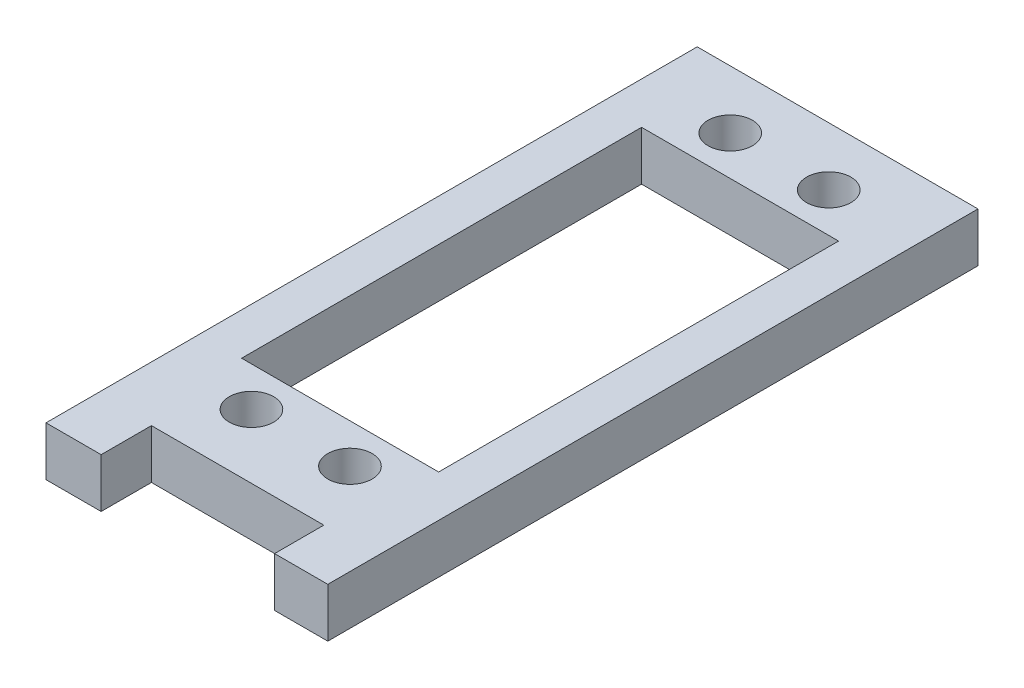
ISO-10303-21;
HEADER;
FILE_DESCRIPTION(('STEP AP214'),'2;1');
FILE_NAME('part.step','',(''),(''),'','','');
FILE_SCHEMA(('AUTOMOTIVE_DESIGN { 1 0 10303 214 1 1 1 1 }'));
ENDSEC;
DATA;
#1=APPLICATION_CONTEXT('core data for automotive mechanical design processes');
#2=APPLICATION_PROTOCOL_DEFINITION('international standard','automotive_design',2000,#1);
#3=PRODUCT_CONTEXT('',#1,'mechanical');
#4=PRODUCT('Part','Part','',(#3));
#5=PRODUCT_RELATED_PRODUCT_CATEGORY('part','',(#4));
#6=PRODUCT_DEFINITION_FORMATION('','',#4);
#7=PRODUCT_DEFINITION_CONTEXT('part definition',#1,'design');
#8=PRODUCT_DEFINITION('design','',#6,#7);
#9=PRODUCT_DEFINITION_SHAPE('','',#8);
#10=(LENGTH_UNIT() NAMED_UNIT(*) SI_UNIT(.MILLI.,.METRE.));
#11=(NAMED_UNIT(*) PLANE_ANGLE_UNIT() SI_UNIT($,.RADIAN.));
#12=(NAMED_UNIT(*) SI_UNIT($,.STERADIAN.) SOLID_ANGLE_UNIT());
#13=UNCERTAINTY_MEASURE_WITH_UNIT(LENGTH_MEASURE(1.E-05),#10,'distance_accuracy_value','');
#14=(GEOMETRIC_REPRESENTATION_CONTEXT(3) GLOBAL_UNCERTAINTY_ASSIGNED_CONTEXT((#13)) GLOBAL_UNIT_ASSIGNED_CONTEXT((#10,
#11,#12)) REPRESENTATION_CONTEXT('',''));
#15=CARTESIAN_POINT('',(0.,0.,0.));
#16=DIRECTION('',(0.,0.,1.));
#17=DIRECTION('',(1.,0.,0.));
#18=AXIS2_PLACEMENT_3D('',#15,#16,#17);
#19=CARTESIAN_POINT('',(0.,5.,0.));
#20=DIRECTION('',(0.,-1.,0.));
#21=DIRECTION('',(0.,0.,-1.));
#22=AXIS2_PLACEMENT_3D('',#19,#20,#21);
#23=PLANE('',#22);
#24=DIRECTION('',(0.,0.,-1.));
#25=VECTOR('',#24,1.);
#26=CARTESIAN_POINT('',(24.25,5.,-7.4));
#27=LINE('',#26,#25);
#28=CARTESIAN_POINT('',(24.25,5.,56.1));
#29=VERTEX_POINT('',#28);
#30=CARTESIAN_POINT('',(24.25,5.,-9.9));
#31=VERTEX_POINT('',#30);
#32=EDGE_CURVE('E161',#29,#31,#27,.T.);
#33=ORIENTED_EDGE('',*,*,#32,.T.);
#34=DIRECTION('',(-1.,0.,0.));
#35=VECTOR('',#34,1.);
#36=CARTESIAN_POINT('',(-4.25,5.,-9.9));
#37=LINE('',#36,#35);
#38=CARTESIAN_POINT('',(-4.25,5.,-9.9));
#39=VERTEX_POINT('',#38);
#40=EDGE_CURVE('E164',#31,#39,#37,.T.);
#41=ORIENTED_EDGE('',*,*,#40,.T.);
#42=DIRECTION('',(0.,0.,1.));
#43=VECTOR('',#42,1.);
#44=CARTESIAN_POINT('',(-4.25,5.,-7.4));
#45=LINE('',#44,#43);
#46=CARTESIAN_POINT('',(-4.25,5.,56.2048021464785));
#47=VERTEX_POINT('',#46);
#48=EDGE_CURVE('E167',#39,#47,#45,.T.);
#49=ORIENTED_EDGE('',*,*,#48,.T.);
#50=DIRECTION('',(1.,0.,0.));
#51=VECTOR('',#50,1.);
#52=CARTESIAN_POINT('',(1.34811792568801,5.,56.2048021464785));
#53=LINE('',#52,#51);
#54=CARTESIAN_POINT('',(1.34811792568801,5.,56.2048021464785));
#55=VERTEX_POINT('',#54);
#56=EDGE_CURVE('E169',#47,#55,#53,.T.);
#57=ORIENTED_EDGE('',*,*,#56,.T.);
#58=DIRECTION('',(0.,0.,-1.));
#59=VECTOR('',#58,1.);
#60=CARTESIAN_POINT('',(1.34811792568801,5.,56.2048021464785));
#61=LINE('',#60,#59);
#62=CARTESIAN_POINT('',(1.34811792568801,5.,51.1));
#63=VERTEX_POINT('',#62);
#64=EDGE_CURVE('E171',#55,#63,#61,.T.);
#65=ORIENTED_EDGE('',*,*,#64,.T.);
#66=DIRECTION('',(1.,0.,0.));
#67=VECTOR('',#66,1.);
#68=CARTESIAN_POINT('',(1.34811792568801,5.,51.1));
#69=LINE('',#68,#67);
#70=CARTESIAN_POINT('',(18.848117925688,5.,51.1));
#71=VERTEX_POINT('',#70);
#72=EDGE_CURVE('E173',#63,#71,#69,.T.);
#73=ORIENTED_EDGE('',*,*,#72,.T.);
#74=DIRECTION('',(0.,0.,1.));
#75=VECTOR('',#74,1.);
#76=CARTESIAN_POINT('',(18.848117925688,5.,56.1));
#77=LINE('',#76,#75);
#78=CARTESIAN_POINT('',(18.848117925688,5.,56.1));
#79=VERTEX_POINT('',#78);
#80=EDGE_CURVE('E175',#71,#79,#77,.T.);
#81=ORIENTED_EDGE('',*,*,#80,.T.);
#82=DIRECTION('',(1.,0.,0.));
#83=VECTOR('',#82,1.);
#84=CARTESIAN_POINT('',(18.848117925688,5.,56.1));
#85=LINE('',#84,#83);
#86=EDGE_CURVE('E177',#79,#29,#85,.T.);
#87=ORIENTED_EDGE('',*,*,#86,.T.);
#88=EDGE_LOOP('',(#33,#41,#49,#57,#65,#73,#81,#87));
#89=FACE_BOUND('',#88,.T.);
#90=DIRECTION('',(0.,0.,1.));
#91=VECTOR('',#90,1.);
#92=CARTESIAN_POINT('',(0.,5.,0.));
#93=LINE('',#92,#91);
#94=CARTESIAN_POINT('',(0.,5.,0.));
#95=VERTEX_POINT('',#94);
#96=CARTESIAN_POINT('',(0.,5.,40.6));
#97=VERTEX_POINT('',#96);
#98=EDGE_CURVE('E122',#95,#97,#93,.T.);
#99=ORIENTED_EDGE('',*,*,#98,.F.);
#100=DIRECTION('',(-1.,0.,0.));
#101=VECTOR('',#100,1.);
#102=CARTESIAN_POINT('',(0.,5.,0.));
#103=LINE('',#102,#101);
#104=CARTESIAN_POINT('',(20.,5.,0.));
#105=VERTEX_POINT('',#104);
#106=EDGE_CURVE('E145',#105,#95,#103,.T.);
#107=ORIENTED_EDGE('',*,*,#106,.F.);
#108=DIRECTION('',(0.,0.,-1.));
#109=VECTOR('',#108,1.);
#110=CARTESIAN_POINT('',(20.,5.,0.));
#111=LINE('',#110,#109);
#112=CARTESIAN_POINT('',(20.,5.,40.6));
#113=VERTEX_POINT('',#112);
#114=EDGE_CURVE('E143',#113,#105,#111,.T.);
#115=ORIENTED_EDGE('',*,*,#114,.F.);
#116=DIRECTION('',(1.,0.,0.));
#117=VECTOR('',#116,1.);
#118=CARTESIAN_POINT('',(0.,5.,40.6));
#119=LINE('',#118,#117);
#120=EDGE_CURVE('E130',#97,#113,#119,.T.);
#121=ORIENTED_EDGE('',*,*,#120,.F.);
#122=EDGE_LOOP('',(#99,#107,#115,#121));
#123=FACE_BOUND('',#122,.T.);
#124=CARTESIAN_POINT('',(5.,5.,-3.99999999999999));
#125=DIRECTION('',(0.,1.,0.));
#126=DIRECTION('',(0.,0.,1.));
#127=AXIS2_PLACEMENT_3D('',#124,#125,#126);
#128=CIRCLE('',#127,2.25);
#129=CARTESIAN_POINT('',(5.,5.,-1.74999999999999));
#130=VERTEX_POINT('',#129);
#131=EDGE_CURVE('E151',#130,#130,#128,.T.);
#132=ORIENTED_EDGE('',*,*,#131,.F.);
#133=EDGE_LOOP('',(#132));
#134=FACE_BOUND('',#133,.T.);
#135=CARTESIAN_POINT('',(15.,5.,-3.99999999999999));
#136=DIRECTION('',(0.,1.,0.));
#137=DIRECTION('',(0.,0.,-1.));
#138=AXIS2_PLACEMENT_3D('',#135,#136,#137);
#139=CIRCLE('',#138,2.25);
#140=CARTESIAN_POINT('',(15.,5.,-6.25));
#141=VERTEX_POINT('',#140);
#142=EDGE_CURVE('E443',#141,#141,#139,.T.);
#143=ORIENTED_EDGE('',*,*,#142,.F.);
#144=EDGE_LOOP('',(#143));
#145=FACE_BOUND('',#144,.T.);
#146=CARTESIAN_POINT('',(5.00000000000001,5.,44.6));
#147=DIRECTION('',(0.,1.,0.));
#148=DIRECTION('',(0.,0.,-1.));
#149=AXIS2_PLACEMENT_3D('',#146,#147,#148);
#150=CIRCLE('',#149,2.25);
#151=CARTESIAN_POINT('',(5.00000000000001,5.,42.35));
#152=VERTEX_POINT('',#151);
#153=EDGE_CURVE('E437',#152,#152,#150,.T.);
#154=ORIENTED_EDGE('',*,*,#153,.F.);
#155=EDGE_LOOP('',(#154));
#156=FACE_BOUND('',#155,.T.);
#157=CARTESIAN_POINT('',(15.,5.,44.6));
#158=DIRECTION('',(0.,1.,0.));
#159=DIRECTION('',(0.,0.,1.));
#160=AXIS2_PLACEMENT_3D('',#157,#158,#159);
#161=CIRCLE('',#160,2.25000000000001);
#162=CARTESIAN_POINT('',(15.,5.,46.85));
#163=VERTEX_POINT('',#162);
#164=EDGE_CURVE('E428',#163,#163,#161,.T.);
#165=ORIENTED_EDGE('',*,*,#164,.F.);
#166=EDGE_LOOP('',(#165));
#167=FACE_BOUND('',#166,.T.);
#168=ADVANCED_FACE('F33',(#89,#123,#134,#145,#156,#167),#23,.F.);
#169=CARTESIAN_POINT('',(0.,0.,0.));
#170=DIRECTION('',(0.,-1.,0.));
#171=DIRECTION('',(0.,0.,-1.));
#172=AXIS2_PLACEMENT_3D('',#169,#170,#171);
#173=PLANE('',#172);
#174=CARTESIAN_POINT('',(5.00000000000001,0.,44.6));
#175=DIRECTION('',(0.,1.,0.));
#176=DIRECTION('',(0.,0.,-1.));
#177=AXIS2_PLACEMENT_3D('',#174,#175,#176);
#178=CIRCLE('',#177,2.25);
#179=CARTESIAN_POINT('',(5.00000000000001,0.,42.35));
#180=VERTEX_POINT('',#179);
#181=EDGE_CURVE('E434',#180,#180,#178,.T.);
#182=ORIENTED_EDGE('',*,*,#181,.T.);
#183=EDGE_LOOP('',(#182));
#184=FACE_BOUND('',#183,.T.);
#185=CARTESIAN_POINT('',(5.,0.,-3.99999999999999));
#186=DIRECTION('',(0.,1.,0.));
#187=DIRECTION('',(0.,0.,1.));
#188=AXIS2_PLACEMENT_3D('',#185,#186,#187);
#189=CIRCLE('',#188,2.25);
#190=CARTESIAN_POINT('',(5.,0.,-1.74999999999999));
#191=VERTEX_POINT('',#190);
#192=EDGE_CURVE('E446',#191,#191,#189,.T.);
#193=ORIENTED_EDGE('',*,*,#192,.T.);
#194=EDGE_LOOP('',(#193));
#195=FACE_BOUND('',#194,.T.);
#196=DIRECTION('',(-1.,0.,0.));
#197=VECTOR('',#196,1.);
#198=CARTESIAN_POINT('',(-4.25,0.,-9.9));
#199=LINE('',#198,#197);
#200=CARTESIAN_POINT('',(24.25,0.,-9.9));
#201=VERTEX_POINT('',#200);
#202=CARTESIAN_POINT('',(-4.25,0.,-9.9));
#203=VERTEX_POINT('',#202);
#204=EDGE_CURVE('E138',#201,#203,#199,.T.);
#205=ORIENTED_EDGE('',*,*,#204,.F.);
#206=DIRECTION('',(0.,0.,-1.));
#207=VECTOR('',#206,1.);
#208=CARTESIAN_POINT('',(24.25,0.,48.));
#209=LINE('',#208,#207);
#210=CARTESIAN_POINT('',(24.25,0.,56.1));
#211=VERTEX_POINT('',#210);
#212=EDGE_CURVE('E165',#211,#201,#209,.T.);
#213=ORIENTED_EDGE('',*,*,#212,.F.);
#214=DIRECTION('',(1.,0.,0.));
#215=VECTOR('',#214,1.);
#216=CARTESIAN_POINT('',(18.848117925688,0.,56.1));
#217=LINE('',#216,#215);
#218=CARTESIAN_POINT('',(18.848117925688,0.,56.1));
#219=VERTEX_POINT('',#218);
#220=EDGE_CURVE('E193',#219,#211,#217,.T.);
#221=ORIENTED_EDGE('',*,*,#220,.F.);
#222=DIRECTION('',(0.,0.,1.));
#223=VECTOR('',#222,1.);
#224=CARTESIAN_POINT('',(18.848117925688,0.,56.1));
#225=LINE('',#224,#223);
#226=CARTESIAN_POINT('',(18.848117925688,0.,51.1));
#227=VERTEX_POINT('',#226);
#228=EDGE_CURVE('E191',#227,#219,#225,.T.);
#229=ORIENTED_EDGE('',*,*,#228,.F.);
#230=DIRECTION('',(1.,0.,0.));
#231=VECTOR('',#230,1.);
#232=CARTESIAN_POINT('',(1.34811792568801,0.,51.1));
#233=LINE('',#232,#231);
#234=CARTESIAN_POINT('',(1.34811792568801,0.,51.1));
#235=VERTEX_POINT('',#234);
#236=EDGE_CURVE('E189',#235,#227,#233,.T.);
#237=ORIENTED_EDGE('',*,*,#236,.F.);
#238=DIRECTION('',(0.,0.,-1.));
#239=VECTOR('',#238,1.);
#240=CARTESIAN_POINT('',(1.34811792568801,0.,56.2048021464785));
#241=LINE('',#240,#239);
#242=CARTESIAN_POINT('',(1.34811792568801,0.,56.2048021464785));
#243=VERTEX_POINT('',#242);
#244=EDGE_CURVE('E187',#243,#235,#241,.T.);
#245=ORIENTED_EDGE('',*,*,#244,.F.);
#246=DIRECTION('',(1.,0.,0.));
#247=VECTOR('',#246,1.);
#248=CARTESIAN_POINT('',(1.34811792568801,0.,56.2048021464785));
#249=LINE('',#248,#247);
#250=CARTESIAN_POINT('',(-4.25,0.,56.2048021464785));
#251=VERTEX_POINT('',#250);
#252=EDGE_CURVE('E185',#251,#243,#249,.T.);
#253=ORIENTED_EDGE('',*,*,#252,.F.);
#254=DIRECTION('',(0.,0.,1.));
#255=VECTOR('',#254,1.);
#256=CARTESIAN_POINT('',(-4.25,0.,48.));
#257=LINE('',#256,#255);
#258=EDGE_CURVE('E183',#203,#251,#257,.T.);
#259=ORIENTED_EDGE('',*,*,#258,.F.);
#260=EDGE_LOOP('',(#205,#213,#221,#229,#237,#245,#253,#259));
#261=FACE_BOUND('',#260,.T.);
#262=DIRECTION('',(-1.,0.,0.));
#263=VECTOR('',#262,1.);
#264=CARTESIAN_POINT('',(0.,0.,0.));
#265=LINE('',#264,#263);
#266=CARTESIAN_POINT('',(20.,0.,0.));
#267=VERTEX_POINT('',#266);
#268=CARTESIAN_POINT('',(0.,0.,0.));
#269=VERTEX_POINT('',#268);
#270=EDGE_CURVE('E131',#267,#269,#265,.T.);
#271=ORIENTED_EDGE('',*,*,#270,.T.);
#272=DIRECTION('',(0.,0.,1.));
#273=VECTOR('',#272,1.);
#274=CARTESIAN_POINT('',(0.,0.,0.));
#275=LINE('',#274,#273);
#276=CARTESIAN_POINT('',(0.,0.,40.6));
#277=VERTEX_POINT('',#276);
#278=EDGE_CURVE('E56',#269,#277,#275,.T.);
#279=ORIENTED_EDGE('',*,*,#278,.T.);
#280=DIRECTION('',(1.,0.,0.));
#281=VECTOR('',#280,1.);
#282=CARTESIAN_POINT('',(0.,0.,40.6));
#283=LINE('',#282,#281);
#284=CARTESIAN_POINT('',(20.,0.,40.6));
#285=VERTEX_POINT('',#284);
#286=EDGE_CURVE('E137',#277,#285,#283,.T.);
#287=ORIENTED_EDGE('',*,*,#286,.T.);
#288=DIRECTION('',(0.,0.,-1.));
#289=VECTOR('',#288,1.);
#290=CARTESIAN_POINT('',(20.,0.,0.));
#291=LINE('',#290,#289);
#292=EDGE_CURVE('E153',#285,#267,#291,.T.);
#293=ORIENTED_EDGE('',*,*,#292,.T.);
#294=EDGE_LOOP('',(#271,#279,#287,#293));
#295=FACE_BOUND('',#294,.T.);
#296=CARTESIAN_POINT('',(15.,0.,-3.99999999999999));
#297=DIRECTION('',(0.,1.,0.));
#298=DIRECTION('',(0.,0.,-1.));
#299=AXIS2_PLACEMENT_3D('',#296,#297,#298);
#300=CIRCLE('',#299,2.25);
#301=CARTESIAN_POINT('',(15.,0.,-6.25));
#302=VERTEX_POINT('',#301);
#303=EDGE_CURVE('E440',#302,#302,#300,.T.);
#304=ORIENTED_EDGE('',*,*,#303,.T.);
#305=EDGE_LOOP('',(#304));
#306=FACE_BOUND('',#305,.T.);
#307=CARTESIAN_POINT('',(15.,0.,44.6));
#308=DIRECTION('',(0.,1.,0.));
#309=DIRECTION('',(0.,0.,1.));
#310=AXIS2_PLACEMENT_3D('',#307,#308,#309);
#311=CIRCLE('',#310,2.25000000000001);
#312=CARTESIAN_POINT('',(15.,0.,46.85));
#313=VERTEX_POINT('',#312);
#314=EDGE_CURVE('E431',#313,#313,#311,.T.);
#315=ORIENTED_EDGE('',*,*,#314,.T.);
#316=EDGE_LOOP('',(#315));
#317=FACE_BOUND('',#316,.T.);
#318=ADVANCED_FACE('F223',(#184,#195,#261,#295,#306,#317),#173,.T.);
#319=CARTESIAN_POINT('',(-4.25,5.,-9.9));
#320=DIRECTION('',(0.,0.,1.));
#321=DIRECTION('',(1.,0.,0.));
#322=AXIS2_PLACEMENT_3D('',#319,#320,#321);
#323=PLANE('',#322);
#324=ORIENTED_EDGE('',*,*,#204,.T.);
#325=DIRECTION('',(0.,-1.,0.));
#326=VECTOR('',#325,1.);
#327=CARTESIAN_POINT('',(-4.25,5.,-9.9));
#328=LINE('',#327,#326);
#329=EDGE_CURVE('E41',#39,#203,#328,.T.);
#330=ORIENTED_EDGE('',*,*,#329,.F.);
#331=ORIENTED_EDGE('',*,*,#40,.F.);
#332=DIRECTION('',(0.,-1.,0.));
#333=VECTOR('',#332,1.);
#334=CARTESIAN_POINT('',(24.25,5.,-9.9));
#335=LINE('',#334,#333);
#336=EDGE_CURVE('E11',#31,#201,#335,.T.);
#337=ORIENTED_EDGE('',*,*,#336,.T.);
#338=EDGE_LOOP('',(#324,#330,#331,#337));
#339=FACE_BOUND('',#338,.T.);
#340=ADVANCED_FACE('F35',(#339),#323,.F.);
#341=CARTESIAN_POINT('',(-4.25,5.,48.));
#342=DIRECTION('',(1.,0.,0.));
#343=DIRECTION('',(0.,0.,-1.));
#344=AXIS2_PLACEMENT_3D('',#341,#342,#343);
#345=PLANE('',#344);
#346=ORIENTED_EDGE('',*,*,#258,.T.);
#347=DIRECTION('',(0.,-1.,0.));
#348=VECTOR('',#347,1.);
#349=CARTESIAN_POINT('',(-4.25,5.,56.2048021464785));
#350=LINE('',#349,#348);
#351=EDGE_CURVE('E211',#47,#251,#350,.T.);
#352=ORIENTED_EDGE('',*,*,#351,.F.);
#353=ORIENTED_EDGE('',*,*,#48,.F.);
#354=ORIENTED_EDGE('',*,*,#329,.T.);
#355=EDGE_LOOP('',(#346,#352,#353,#354));
#356=FACE_BOUND('',#355,.T.);
#357=ADVANCED_FACE('F217',(#356),#345,.F.);
#358=CARTESIAN_POINT('',(1.34811792568801,5.,56.2048021464785));
#359=DIRECTION('',(0.,0.,-1.));
#360=DIRECTION('',(-1.,0.,0.));
#361=AXIS2_PLACEMENT_3D('',#358,#359,#360);
#362=PLANE('',#361);
#363=ORIENTED_EDGE('',*,*,#252,.T.);
#364=DIRECTION('',(0.,-1.,0.));
#365=VECTOR('',#364,1.);
#366=CARTESIAN_POINT('',(1.34811792568801,5.,56.2048021464785));
#367=LINE('',#366,#365);
#368=EDGE_CURVE('E208',#55,#243,#367,.T.);
#369=ORIENTED_EDGE('',*,*,#368,.F.);
#370=ORIENTED_EDGE('',*,*,#56,.F.);
#371=ORIENTED_EDGE('',*,*,#351,.T.);
#372=EDGE_LOOP('',(#363,#369,#370,#371));
#373=FACE_BOUND('',#372,.T.);
#374=ADVANCED_FACE('F231',(#373),#362,.F.);
#375=CARTESIAN_POINT('',(1.34811792568801,5.,56.2048021464785));
#376=DIRECTION('',(-1.,0.,0.));
#377=DIRECTION('',(0.,0.,1.));
#378=AXIS2_PLACEMENT_3D('',#375,#376,#377);
#379=PLANE('',#378);
#380=ORIENTED_EDGE('',*,*,#244,.T.);
#381=DIRECTION('',(0.,-1.,0.));
#382=VECTOR('',#381,1.);
#383=CARTESIAN_POINT('',(1.34811792568801,5.,51.1));
#384=LINE('',#383,#382);
#385=EDGE_CURVE('E205',#63,#235,#384,.T.);
#386=ORIENTED_EDGE('',*,*,#385,.F.);
#387=ORIENTED_EDGE('',*,*,#64,.F.);
#388=ORIENTED_EDGE('',*,*,#368,.T.);
#389=EDGE_LOOP('',(#380,#386,#387,#388));
#390=FACE_BOUND('',#389,.T.);
#391=ADVANCED_FACE('F235',(#390),#379,.F.);
#392=CARTESIAN_POINT('',(1.34811792568801,5.,51.1));
#393=DIRECTION('',(0.,0.,-1.));
#394=DIRECTION('',(-1.,0.,0.));
#395=AXIS2_PLACEMENT_3D('',#392,#393,#394);
#396=PLANE('',#395);
#397=ORIENTED_EDGE('',*,*,#236,.T.);
#398=DIRECTION('',(0.,-1.,0.));
#399=VECTOR('',#398,1.);
#400=CARTESIAN_POINT('',(18.848117925688,5.,51.1));
#401=LINE('',#400,#399);
#402=EDGE_CURVE('E202',#71,#227,#401,.T.);
#403=ORIENTED_EDGE('',*,*,#402,.F.);
#404=ORIENTED_EDGE('',*,*,#72,.F.);
#405=ORIENTED_EDGE('',*,*,#385,.T.);
#406=EDGE_LOOP('',(#397,#403,#404,#405));
#407=FACE_BOUND('',#406,.T.);
#408=ADVANCED_FACE('F252',(#407),#396,.F.);
#409=CARTESIAN_POINT('',(18.848117925688,5.,56.1));
#410=DIRECTION('',(1.,0.,0.));
#411=DIRECTION('',(0.,0.,-1.));
#412=AXIS2_PLACEMENT_3D('',#409,#410,#411);
#413=PLANE('',#412);
#414=ORIENTED_EDGE('',*,*,#228,.T.);
#415=DIRECTION('',(0.,-1.,0.));
#416=VECTOR('',#415,1.);
#417=CARTESIAN_POINT('',(18.848117925688,5.,56.1));
#418=LINE('',#417,#416);
#419=EDGE_CURVE('E199',#79,#219,#418,.T.);
#420=ORIENTED_EDGE('',*,*,#419,.F.);
#421=ORIENTED_EDGE('',*,*,#80,.F.);
#422=ORIENTED_EDGE('',*,*,#402,.T.);
#423=EDGE_LOOP('',(#414,#420,#421,#422));
#424=FACE_BOUND('',#423,.T.);
#425=ADVANCED_FACE('F249',(#424),#413,.F.);
#426=CARTESIAN_POINT('',(18.848117925688,5.,56.1));
#427=DIRECTION('',(0.,0.,-1.));
#428=DIRECTION('',(-1.,0.,0.));
#429=AXIS2_PLACEMENT_3D('',#426,#427,#428);
#430=PLANE('',#429);
#431=ORIENTED_EDGE('',*,*,#220,.T.);
#432=DIRECTION('',(0.,-1.,0.));
#433=VECTOR('',#432,1.);
#434=CARTESIAN_POINT('',(24.25,5.,56.1));
#435=LINE('',#434,#433);
#436=EDGE_CURVE('E180',#29,#211,#435,.T.);
#437=ORIENTED_EDGE('',*,*,#436,.F.);
#438=ORIENTED_EDGE('',*,*,#86,.F.);
#439=ORIENTED_EDGE('',*,*,#419,.T.);
#440=EDGE_LOOP('',(#431,#437,#438,#439));
#441=FACE_BOUND('',#440,.T.);
#442=ADVANCED_FACE('F245',(#441),#430,.F.);
#443=CARTESIAN_POINT('',(24.25,5.,48.));
#444=DIRECTION('',(-1.,0.,0.));
#445=DIRECTION('',(0.,0.,1.));
#446=AXIS2_PLACEMENT_3D('',#443,#444,#445);
#447=PLANE('',#446);
#448=ORIENTED_EDGE('',*,*,#212,.T.);
#449=ORIENTED_EDGE('',*,*,#336,.F.);
#450=ORIENTED_EDGE('',*,*,#32,.F.);
#451=ORIENTED_EDGE('',*,*,#436,.T.);
#452=EDGE_LOOP('',(#448,#449,#450,#451));
#453=FACE_BOUND('',#452,.T.);
#454=ADVANCED_FACE('F243',(#453),#447,.F.);
#455=CARTESIAN_POINT('',(0.,5.,0.));
#456=DIRECTION('',(1.,0.,0.));
#457=DIRECTION('',(0.,0.,-1.));
#458=AXIS2_PLACEMENT_3D('',#455,#456,#457);
#459=PLANE('',#458);
#460=ORIENTED_EDGE('',*,*,#278,.F.);
#461=DIRECTION('',(0.,-1.,0.));
#462=VECTOR('',#461,1.);
#463=CARTESIAN_POINT('',(0.,5.,0.));
#464=LINE('',#463,#462);
#465=EDGE_CURVE('E126',#95,#269,#464,.T.);
#466=ORIENTED_EDGE('',*,*,#465,.F.);
#467=ORIENTED_EDGE('',*,*,#98,.T.);
#468=DIRECTION('',(0.,-1.,0.));
#469=VECTOR('',#468,1.);
#470=CARTESIAN_POINT('',(0.,5.,40.6));
#471=LINE('',#470,#469);
#472=EDGE_CURVE('E125',#97,#277,#471,.T.);
#473=ORIENTED_EDGE('',*,*,#472,.T.);
#474=EDGE_LOOP('',(#460,#466,#467,#473));
#475=FACE_BOUND('',#474,.T.);
#476=ADVANCED_FACE('F124',(#475),#459,.T.);
#477=CARTESIAN_POINT('',(0.,5.,40.6));
#478=DIRECTION('',(0.,0.,-1.));
#479=DIRECTION('',(-1.,0.,0.));
#480=AXIS2_PLACEMENT_3D('',#477,#478,#479);
#481=PLANE('',#480);
#482=ORIENTED_EDGE('',*,*,#286,.F.);
#483=ORIENTED_EDGE('',*,*,#472,.F.);
#484=ORIENTED_EDGE('',*,*,#120,.T.);
#485=DIRECTION('',(0.,-1.,0.));
#486=VECTOR('',#485,1.);
#487=CARTESIAN_POINT('',(20.,5.,40.6));
#488=LINE('',#487,#486);
#489=EDGE_CURVE('E139',#113,#285,#488,.T.);
#490=ORIENTED_EDGE('',*,*,#489,.T.);
#491=EDGE_LOOP('',(#482,#483,#484,#490));
#492=FACE_BOUND('',#491,.T.);
#493=ADVANCED_FACE('F134',(#492),#481,.T.);
#494=CARTESIAN_POINT('',(20.,5.,0.));
#495=DIRECTION('',(-1.,0.,0.));
#496=DIRECTION('',(0.,0.,1.));
#497=AXIS2_PLACEMENT_3D('',#494,#495,#496);
#498=PLANE('',#497);
#499=ORIENTED_EDGE('',*,*,#292,.F.);
#500=ORIENTED_EDGE('',*,*,#489,.F.);
#501=ORIENTED_EDGE('',*,*,#114,.T.);
#502=DIRECTION('',(0.,-1.,0.));
#503=VECTOR('',#502,1.);
#504=CARTESIAN_POINT('',(20.,5.,0.));
#505=LINE('',#504,#503);
#506=EDGE_CURVE('E48',#105,#267,#505,.T.);
#507=ORIENTED_EDGE('',*,*,#506,.T.);
#508=EDGE_LOOP('',(#499,#500,#501,#507));
#509=FACE_BOUND('',#508,.T.);
#510=ADVANCED_FACE('F293',(#509),#498,.T.);
#511=CARTESIAN_POINT('',(0.,5.,0.));
#512=DIRECTION('',(0.,0.,1.));
#513=DIRECTION('',(1.,0.,0.));
#514=AXIS2_PLACEMENT_3D('',#511,#512,#513);
#515=PLANE('',#514);
#516=ORIENTED_EDGE('',*,*,#270,.F.);
#517=ORIENTED_EDGE('',*,*,#506,.F.);
#518=ORIENTED_EDGE('',*,*,#106,.T.);
#519=ORIENTED_EDGE('',*,*,#465,.T.);
#520=EDGE_LOOP('',(#516,#517,#518,#519));
#521=FACE_BOUND('',#520,.T.);
#522=ADVANCED_FACE('F299',(#521),#515,.T.);
#523=CARTESIAN_POINT('',(5.,5.,-3.99999999999999));
#524=DIRECTION('',(0.,-1.,0.));
#525=DIRECTION('',(0.,0.,-1.));
#526=AXIS2_PLACEMENT_3D('',#523,#524,#525);
#527=CYLINDRICAL_SURFACE('',#526,2.25);
#528=ORIENTED_EDGE('',*,*,#131,.T.);
#529=EDGE_LOOP('',(#528));
#530=FACE_BOUND('',#529,.T.);
#531=ORIENTED_EDGE('',*,*,#192,.F.);
#532=EDGE_LOOP('',(#531));
#533=FACE_BOUND('',#532,.T.);
#534=ADVANCED_FACE('F307',(#530,#533),#527,.F.);
#535=CARTESIAN_POINT('',(15.,5.,-3.99999999999999));
#536=DIRECTION('',(0.,-1.,0.));
#537=DIRECTION('',(0.,0.,-1.));
#538=AXIS2_PLACEMENT_3D('',#535,#536,#537);
#539=CYLINDRICAL_SURFACE('',#538,2.25);
#540=ORIENTED_EDGE('',*,*,#142,.T.);
#541=EDGE_LOOP('',(#540));
#542=FACE_BOUND('',#541,.T.);
#543=ORIENTED_EDGE('',*,*,#303,.F.);
#544=EDGE_LOOP('',(#543));
#545=FACE_BOUND('',#544,.T.);
#546=ADVANCED_FACE('F314',(#542,#545),#539,.F.);
#547=CARTESIAN_POINT('',(5.00000000000001,5.,44.6));
#548=DIRECTION('',(0.,-1.,0.));
#549=DIRECTION('',(0.,0.,-1.));
#550=AXIS2_PLACEMENT_3D('',#547,#548,#549);
#551=CYLINDRICAL_SURFACE('',#550,2.25);
#552=ORIENTED_EDGE('',*,*,#153,.T.);
#553=EDGE_LOOP('',(#552));
#554=FACE_BOUND('',#553,.T.);
#555=ORIENTED_EDGE('',*,*,#181,.F.);
#556=EDGE_LOOP('',(#555));
#557=FACE_BOUND('',#556,.T.);
#558=ADVANCED_FACE('F322',(#554,#557),#551,.F.);
#559=CARTESIAN_POINT('',(15.,5.,44.6));
#560=DIRECTION('',(0.,-1.,0.));
#561=DIRECTION('',(0.,0.,-1.));
#562=AXIS2_PLACEMENT_3D('',#559,#560,#561);
#563=CYLINDRICAL_SURFACE('',#562,2.25000000000001);
#564=ORIENTED_EDGE('',*,*,#164,.T.);
#565=EDGE_LOOP('',(#564));
#566=FACE_BOUND('',#565,.T.);
#567=ORIENTED_EDGE('',*,*,#314,.F.);
#568=EDGE_LOOP('',(#567));
#569=FACE_BOUND('',#568,.T.);
#570=ADVANCED_FACE('F330',(#566,#569),#563,.F.);
#571=CLOSED_SHELL('',(#168,#318,#340,#357,#374,#391,#408,#425,#442,#454,#476,#493,#510,#522,
#534,#546,#558,#570));
#572=MANIFOLD_SOLID_BREP('B2',#571);
#573=ADVANCED_BREP_SHAPE_REPRESENTATION('',(#18,#572),#14);
#574=SHAPE_DEFINITION_REPRESENTATION(#9,#573);
ENDSEC;
END-ISO-10303-21;
